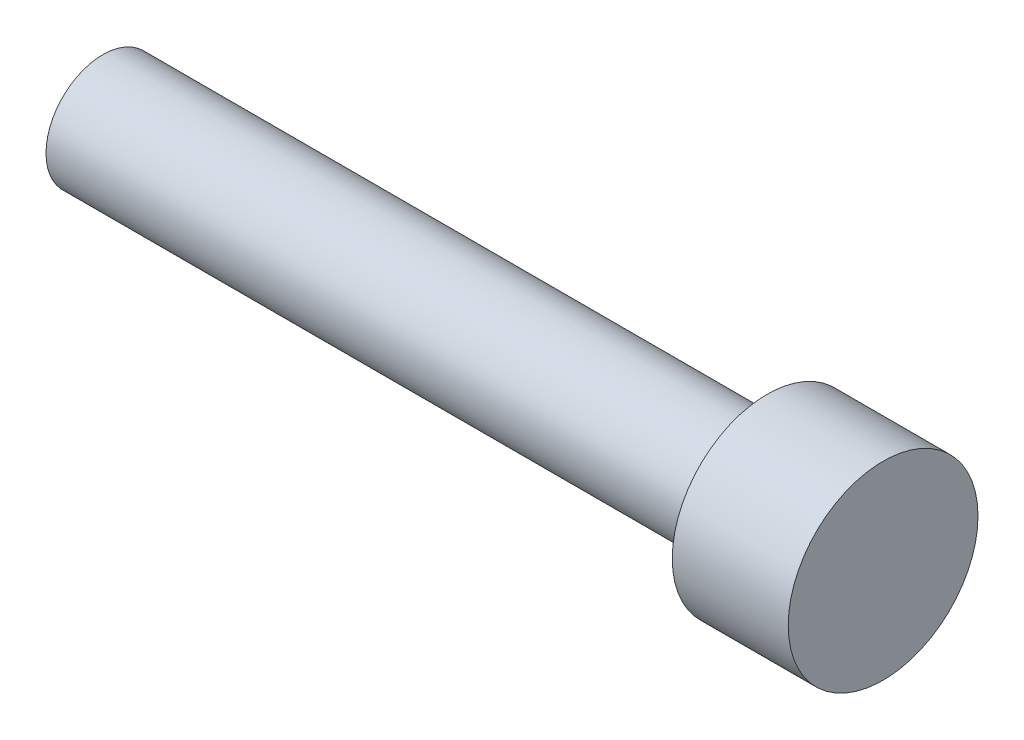
ISO-10303-21;
HEADER;
FILE_DESCRIPTION(('STEP AP214'),'2;1');
FILE_NAME('part.step','',(''),(''),'','','');
FILE_SCHEMA(('AUTOMOTIVE_DESIGN { 1 0 10303 214 1 1 1 1 }'));
ENDSEC;
DATA;
#1=APPLICATION_CONTEXT('core data for automotive mechanical design processes');
#2=APPLICATION_PROTOCOL_DEFINITION('international standard','automotive_design',2000,#1);
#3=PRODUCT_CONTEXT('',#1,'mechanical');
#4=PRODUCT('Part','Part','',(#3));
#5=PRODUCT_RELATED_PRODUCT_CATEGORY('part','',(#4));
#6=PRODUCT_DEFINITION_FORMATION('','',#4);
#7=PRODUCT_DEFINITION_CONTEXT('part definition',#1,'design');
#8=PRODUCT_DEFINITION('design','',#6,#7);
#9=PRODUCT_DEFINITION_SHAPE('','',#8);
#10=(LENGTH_UNIT() NAMED_UNIT(*) SI_UNIT(.MILLI.,.METRE.));
#11=(NAMED_UNIT(*) PLANE_ANGLE_UNIT() SI_UNIT($,.RADIAN.));
#12=(NAMED_UNIT(*) SI_UNIT($,.STERADIAN.) SOLID_ANGLE_UNIT());
#13=UNCERTAINTY_MEASURE_WITH_UNIT(LENGTH_MEASURE(1.E-05),#10,'distance_accuracy_value','');
#14=(GEOMETRIC_REPRESENTATION_CONTEXT(3) GLOBAL_UNCERTAINTY_ASSIGNED_CONTEXT((#13)) GLOBAL_UNIT_ASSIGNED_CONTEXT((#10,
#11,#12)) REPRESENTATION_CONTEXT('',''));
#15=CARTESIAN_POINT('',(0.,0.,0.));
#16=DIRECTION('',(0.,0.,1.));
#17=DIRECTION('',(1.,0.,0.));
#18=AXIS2_PLACEMENT_3D('',#15,#16,#17);
#19=CARTESIAN_POINT('',(23.61,0.,0.));
#20=DIRECTION('',(1.,0.,0.));
#21=DIRECTION('',(0.,0.,-1.));
#22=AXIS2_PLACEMENT_3D('',#19,#20,#21);
#23=PLANE('',#22);
#24=CARTESIAN_POINT('',(23.61,0.,0.));
#25=DIRECTION('',(-1.,0.,0.));
#26=DIRECTION('',(0.,0.,1.));
#27=AXIS2_PLACEMENT_3D('',#24,#25,#26);
#28=CIRCLE('',#27,5.);
#29=CARTESIAN_POINT('',(23.61,0.,5.));
#30=VERTEX_POINT('',#29);
#31=EDGE_CURVE('E10',#30,#30,#28,.T.);
#32=ORIENTED_EDGE('',*,*,#31,.F.);
#33=EDGE_LOOP('',(#32));
#34=FACE_BOUND('',#33,.T.);
#35=ADVANCED_FACE('F37',(#34),#23,.T.);
#36=CARTESIAN_POINT('',(0.,0.,0.));
#37=DIRECTION('',(-1.,0.,0.));
#38=DIRECTION('',(0.,0.,1.));
#39=AXIS2_PLACEMENT_3D('',#36,#37,#38);
#40=CYLINDRICAL_SURFACE('',#39,5.);
#41=ORIENTED_EDGE('',*,*,#31,.T.);
#42=EDGE_LOOP('',(#41));
#43=FACE_BOUND('',#42,.T.);
#44=CARTESIAN_POINT('',(17.5,0.,0.));
#45=DIRECTION('',(-1.,0.,0.));
#46=DIRECTION('',(0.,0.,1.));
#47=AXIS2_PLACEMENT_3D('',#44,#45,#46);
#48=CIRCLE('',#47,5.);
#49=CARTESIAN_POINT('',(17.5,0.,5.));
#50=VERTEX_POINT('',#49);
#51=EDGE_CURVE('E43',#50,#50,#48,.T.);
#52=ORIENTED_EDGE('',*,*,#51,.F.);
#53=EDGE_LOOP('',(#52));
#54=FACE_BOUND('',#53,.T.);
#55=ADVANCED_FACE('F69',(#43,#54),#40,.T.);
#56=CARTESIAN_POINT('',(17.5,0.,0.));
#57=DIRECTION('',(-1.,0.,0.));
#58=DIRECTION('',(0.,0.,1.));
#59=AXIS2_PLACEMENT_3D('',#56,#57,#58);
#60=PLANE('',#59);
#61=ORIENTED_EDGE('',*,*,#51,.T.);
#62=EDGE_LOOP('',(#61));
#63=FACE_BOUND('',#62,.T.);
#64=CARTESIAN_POINT('',(17.5,0.,0.));
#65=DIRECTION('',(-1.,0.,0.));
#66=DIRECTION('',(0.,0.,1.));
#67=AXIS2_PLACEMENT_3D('',#64,#65,#66);
#68=CIRCLE('',#67,3.);
#69=CARTESIAN_POINT('',(17.5,0.,3.));
#70=VERTEX_POINT('',#69);
#71=EDGE_CURVE('E47',#70,#70,#68,.T.);
#72=ORIENTED_EDGE('',*,*,#71,.F.);
#73=EDGE_LOOP('',(#72));
#74=FACE_BOUND('',#73,.T.);
#75=ADVANCED_FACE('F61',(#63,#74),#60,.T.);
#76=CARTESIAN_POINT('',(0.,0.,0.));
#77=DIRECTION('',(-1.,0.,0.));
#78=DIRECTION('',(0.,0.,1.));
#79=AXIS2_PLACEMENT_3D('',#76,#77,#78);
#80=CYLINDRICAL_SURFACE('',#79,3.);
#81=ORIENTED_EDGE('',*,*,#71,.T.);
#82=EDGE_LOOP('',(#81));
#83=FACE_BOUND('',#82,.T.);
#84=CARTESIAN_POINT('',(-17.5,0.,0.));
#85=DIRECTION('',(-1.,0.,0.));
#86=DIRECTION('',(0.,0.,1.));
#87=AXIS2_PLACEMENT_3D('',#84,#85,#86);
#88=CIRCLE('',#87,3.);
#89=CARTESIAN_POINT('',(-17.5,0.,3.));
#90=VERTEX_POINT('',#89);
#91=EDGE_CURVE('E51',#90,#90,#88,.T.);
#92=ORIENTED_EDGE('',*,*,#91,.F.);
#93=EDGE_LOOP('',(#92));
#94=FACE_BOUND('',#93,.T.);
#95=ADVANCED_FACE('F59',(#83,#94),#80,.T.);
#96=CARTESIAN_POINT('',(-17.5,0.,0.));
#97=DIRECTION('',(1.,0.,0.));
#98=DIRECTION('',(0.,0.,-1.));
#99=AXIS2_PLACEMENT_3D('',#96,#97,#98);
#100=PLANE('',#99);
#101=ORIENTED_EDGE('',*,*,#91,.T.);
#102=EDGE_LOOP('',(#101));
#103=FACE_BOUND('',#102,.T.);
#104=ADVANCED_FACE('F57',(#103),#100,.F.);
#105=CLOSED_SHELL('',(#35,#55,#75,#95,#104));
#106=MANIFOLD_SOLID_BREP('B2',#105);
#107=ADVANCED_BREP_SHAPE_REPRESENTATION('',(#18,#106),#14);
#108=SHAPE_DEFINITION_REPRESENTATION(#9,#107);
ENDSEC;
END-ISO-10303-21;
